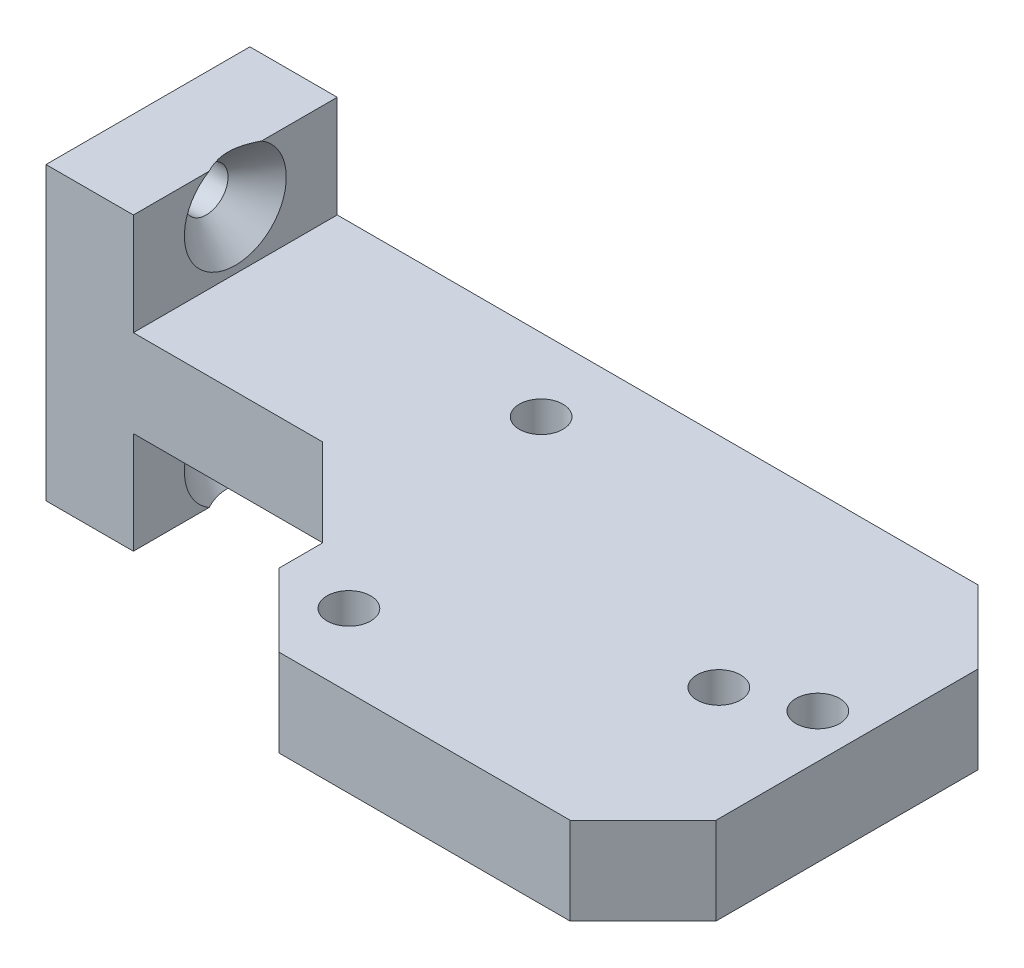
ISO-10303-21;
HEADER;
FILE_DESCRIPTION(('STEP AP214'),'2;1');
FILE_NAME('part.step','',(''),(''),'','','');
FILE_SCHEMA(('AUTOMOTIVE_DESIGN { 1 0 10303 214 1 1 1 1 }'));
ENDSEC;
DATA;
#1=APPLICATION_CONTEXT('core data for automotive mechanical design processes');
#2=APPLICATION_PROTOCOL_DEFINITION('international standard','automotive_design',2000,#1);
#3=PRODUCT_CONTEXT('',#1,'mechanical');
#4=PRODUCT('Part','Part','',(#3));
#5=PRODUCT_RELATED_PRODUCT_CATEGORY('part','',(#4));
#6=PRODUCT_DEFINITION_FORMATION('','',#4);
#7=PRODUCT_DEFINITION_CONTEXT('part definition',#1,'design');
#8=PRODUCT_DEFINITION('design','',#6,#7);
#9=PRODUCT_DEFINITION_SHAPE('','',#8);
#10=(LENGTH_UNIT() NAMED_UNIT(*) SI_UNIT(.MILLI.,.METRE.));
#11=(NAMED_UNIT(*) PLANE_ANGLE_UNIT() SI_UNIT($,.RADIAN.));
#12=(NAMED_UNIT(*) SI_UNIT($,.STERADIAN.) SOLID_ANGLE_UNIT());
#13=UNCERTAINTY_MEASURE_WITH_UNIT(LENGTH_MEASURE(1.E-05),#10,'distance_accuracy_value','');
#14=(GEOMETRIC_REPRESENTATION_CONTEXT(3) GLOBAL_UNCERTAINTY_ASSIGNED_CONTEXT((#13)) GLOBAL_UNIT_ASSIGNED_CONTEXT((#10,
#11,#12)) REPRESENTATION_CONTEXT('',''));
#15=CARTESIAN_POINT('',(0.,0.,0.));
#16=DIRECTION('',(0.,0.,1.));
#17=DIRECTION('',(1.,0.,0.));
#18=AXIS2_PLACEMENT_3D('',#15,#16,#17);
#19=CARTESIAN_POINT('',(0.,3.,0.));
#20=DIRECTION('',(0.,1.,0.));
#21=DIRECTION('',(0.,0.,1.));
#22=AXIS2_PLACEMENT_3D('',#19,#20,#21);
#23=PLANE('',#22);
#24=CARTESIAN_POINT('',(29.8,3.,8.99999999999999));
#25=DIRECTION('',(0.,1.,0.));
#26=DIRECTION('',(0.,0.,1.));
#27=AXIS2_PLACEMENT_3D('',#24,#25,#26);
#28=CIRCLE('',#27,1.5);
#29=CARTESIAN_POINT('',(29.8,3.,10.5));
#30=VERTEX_POINT('',#29);
#31=EDGE_CURVE('E199',#30,#30,#28,.T.);
#32=ORIENTED_EDGE('',*,*,#31,.F.);
#33=EDGE_LOOP('',(#32));
#34=FACE_BOUND('',#33,.T.);
#35=CARTESIAN_POINT('',(25.,3.,-9.00000000000001));
#36=DIRECTION('',(0.,1.,0.));
#37=DIRECTION('',(0.,0.,1.));
#38=AXIS2_PLACEMENT_3D('',#35,#36,#37);
#39=CIRCLE('',#38,1.5);
#40=CARTESIAN_POINT('',(25.,3.,-7.50000000000001));
#41=VERTEX_POINT('',#40);
#42=EDGE_CURVE('E211',#41,#41,#39,.T.);
#43=ORIENTED_EDGE('',*,*,#42,.F.);
#44=EDGE_LOOP('',(#43));
#45=FACE_BOUND('',#44,.T.);
#46=CARTESIAN_POINT('',(52.,3.,-1.00000000000001));
#47=DIRECTION('',(0.,1.,0.));
#48=DIRECTION('',(0.,0.,1.));
#49=AXIS2_PLACEMENT_3D('',#46,#47,#48);
#50=CIRCLE('',#49,1.5);
#51=CARTESIAN_POINT('',(52.,3.,0.499999999999996));
#52=VERTEX_POINT('',#51);
#53=EDGE_CURVE('E205',#52,#52,#50,.T.);
#54=ORIENTED_EDGE('',*,*,#53,.F.);
#55=EDGE_LOOP('',(#54));
#56=FACE_BOUND('',#55,.T.);
#57=CARTESIAN_POINT('',(47.2,3.,0.999999999999996));
#58=DIRECTION('',(0.,1.,0.));
#59=DIRECTION('',(0.,0.,1.));
#60=AXIS2_PLACEMENT_3D('',#57,#58,#59);
#61=CIRCLE('',#60,1.5);
#62=CARTESIAN_POINT('',(47.2,3.,2.5));
#63=VERTEX_POINT('',#62);
#64=EDGE_CURVE('E193',#63,#63,#61,.T.);
#65=ORIENTED_EDGE('',*,*,#64,.F.);
#66=EDGE_LOOP('',(#65));
#67=FACE_BOUND('',#66,.T.);
#68=DIRECTION('',(0.,0.,-1.));
#69=VECTOR('',#68,1.);
#70=CARTESIAN_POINT('',(55.,3.,14.));
#71=LINE('',#70,#69);
#72=CARTESIAN_POINT('',(55.,3.,9.00000000000001));
#73=VERTEX_POINT('',#72);
#74=CARTESIAN_POINT('',(55.,3.,-9.));
#75=VERTEX_POINT('',#74);
#76=EDGE_CURVE('E227',#73,#75,#71,.T.);
#77=ORIENTED_EDGE('',*,*,#76,.T.);
#78=DIRECTION('',(0.707106781186546,0.,0.707106781186549));
#79=VECTOR('',#78,1.);
#80=CARTESIAN_POINT('',(32.0000000000001,3.,-32.));
#81=LINE('',#80,#79);
#82=CARTESIAN_POINT('',(50.,3.,-14.));
#83=VERTEX_POINT('',#82);
#84=EDGE_CURVE('E567',#75,#83,#81,.F.);
#85=ORIENTED_EDGE('',*,*,#84,.T.);
#86=DIRECTION('',(-1.,0.,0.));
#87=VECTOR('',#86,1.);
#88=CARTESIAN_POINT('',(55.,3.,-14.));
#89=LINE('',#88,#87);
#90=CARTESIAN_POINT('',(6.,3.,-14.));
#91=VERTEX_POINT('',#90);
#92=EDGE_CURVE('E217',#83,#91,#89,.T.);
#93=ORIENTED_EDGE('',*,*,#92,.T.);
#94=DIRECTION('',(0.,0.,1.));
#95=VECTOR('',#94,1.);
#96=CARTESIAN_POINT('',(6.,3.,0.));
#97=LINE('',#96,#95);
#98=CARTESIAN_POINT('',(6.,3.,0.));
#99=VERTEX_POINT('',#98);
#100=EDGE_CURVE('E160',#91,#99,#97,.T.);
#101=ORIENTED_EDGE('',*,*,#100,.T.);
#102=DIRECTION('',(1.,0.,0.));
#103=VECTOR('',#102,1.);
#104=CARTESIAN_POINT('',(0.,3.,0.));
#105=LINE('',#104,#103);
#106=CARTESIAN_POINT('',(19.,3.,0.));
#107=VERTEX_POINT('',#106);
#108=EDGE_CURVE('E219',#99,#107,#105,.T.);
#109=ORIENTED_EDGE('',*,*,#108,.T.);
#110=DIRECTION('',(-0.707106781186544,0.,-0.707106781186551));
#111=VECTOR('',#110,1.);
#112=CARTESIAN_POINT('',(25.,3.,6.00000000000004));
#113=LINE('',#112,#111);
#114=CARTESIAN_POINT('',(25.,3.,6.00000000000004));
#115=VERTEX_POINT('',#114);
#116=EDGE_CURVE('E575',#107,#115,#113,.F.);
#117=ORIENTED_EDGE('',*,*,#116,.T.);
#118=DIRECTION('',(0.,0.,1.));
#119=VECTOR('',#118,1.);
#120=CARTESIAN_POINT('',(25.,3.,0.));
#121=LINE('',#120,#119);
#122=CARTESIAN_POINT('',(25.,3.,8.99999999999999));
#123=VERTEX_POINT('',#122);
#124=EDGE_CURVE('E223',#115,#123,#121,.T.);
#125=ORIENTED_EDGE('',*,*,#124,.T.);
#126=DIRECTION('',(-0.707106781186546,0.,-0.707106781186549));
#127=VECTOR('',#126,1.);
#128=CARTESIAN_POINT('',(8.00000000000006,3.,-8.00000000000003));
#129=LINE('',#128,#127);
#130=CARTESIAN_POINT('',(30.,3.,14.));
#131=VERTEX_POINT('',#130);
#132=EDGE_CURVE('E59',#123,#131,#129,.F.);
#133=ORIENTED_EDGE('',*,*,#132,.T.);
#134=DIRECTION('',(1.,0.,0.));
#135=VECTOR('',#134,1.);
#136=CARTESIAN_POINT('',(25.,3.,14.));
#137=LINE('',#136,#135);
#138=CARTESIAN_POINT('',(50.,3.,14.));
#139=VERTEX_POINT('',#138);
#140=EDGE_CURVE('E225',#131,#139,#137,.T.);
#141=ORIENTED_EDGE('',*,*,#140,.T.);
#142=DIRECTION('',(-0.707106781186549,0.,0.707106781186546));
#143=VECTOR('',#142,1.);
#144=CARTESIAN_POINT('',(31.9999999999999,3.,32.));
#145=LINE('',#144,#143);
#146=EDGE_CURVE('E591',#139,#73,#145,.F.);
#147=ORIENTED_EDGE('',*,*,#146,.T.);
#148=EDGE_LOOP('',(#77,#85,#93,#101,#109,#117,#125,#133,#141,#147));
#149=FACE_BOUND('',#148,.T.);
#150=ADVANCED_FACE('F37',(#34,#45,#56,#67,#149),#23,.T.);
#151=CARTESIAN_POINT('',(0.,-3.,0.));
#152=DIRECTION('',(0.,1.,0.));
#153=DIRECTION('',(0.,0.,1.));
#154=AXIS2_PLACEMENT_3D('',#151,#152,#153);
#155=PLANE('',#154);
#156=CARTESIAN_POINT('',(47.2,-3.,0.999999999999996));
#157=DIRECTION('',(0.,1.,0.));
#158=DIRECTION('',(0.,0.,1.));
#159=AXIS2_PLACEMENT_3D('',#156,#157,#158);
#160=CIRCLE('',#159,1.5);
#161=CARTESIAN_POINT('',(47.2,-3.,2.5));
#162=VERTEX_POINT('',#161);
#163=EDGE_CURVE('E192',#162,#162,#160,.T.);
#164=ORIENTED_EDGE('',*,*,#163,.T.);
#165=EDGE_LOOP('',(#164));
#166=FACE_BOUND('',#165,.T.);
#167=CARTESIAN_POINT('',(29.8,-3.,8.99999999999999));
#168=DIRECTION('',(0.,1.,0.));
#169=DIRECTION('',(0.,0.,1.));
#170=AXIS2_PLACEMENT_3D('',#167,#168,#169);
#171=CIRCLE('',#170,1.5);
#172=CARTESIAN_POINT('',(29.8,-3.,10.5));
#173=VERTEX_POINT('',#172);
#174=EDGE_CURVE('E196',#173,#173,#171,.T.);
#175=ORIENTED_EDGE('',*,*,#174,.T.);
#176=EDGE_LOOP('',(#175));
#177=FACE_BOUND('',#176,.T.);
#178=CARTESIAN_POINT('',(52.,-3.,-1.00000000000001));
#179=DIRECTION('',(0.,1.,0.));
#180=DIRECTION('',(0.,0.,1.));
#181=AXIS2_PLACEMENT_3D('',#178,#179,#180);
#182=CIRCLE('',#181,1.5);
#183=CARTESIAN_POINT('',(52.,-3.,0.499999999999996));
#184=VERTEX_POINT('',#183);
#185=EDGE_CURVE('E202',#184,#184,#182,.T.);
#186=ORIENTED_EDGE('',*,*,#185,.T.);
#187=EDGE_LOOP('',(#186));
#188=FACE_BOUND('',#187,.T.);
#189=CARTESIAN_POINT('',(25.,-3.,-9.00000000000001));
#190=DIRECTION('',(0.,1.,0.));
#191=DIRECTION('',(0.,0.,1.));
#192=AXIS2_PLACEMENT_3D('',#189,#190,#191);
#193=CIRCLE('',#192,1.5);
#194=CARTESIAN_POINT('',(25.,-3.,-7.50000000000001));
#195=VERTEX_POINT('',#194);
#196=EDGE_CURVE('E208',#195,#195,#193,.T.);
#197=ORIENTED_EDGE('',*,*,#196,.T.);
#198=EDGE_LOOP('',(#197));
#199=FACE_BOUND('',#198,.T.);
#200=DIRECTION('',(-1.,0.,0.));
#201=VECTOR('',#200,1.);
#202=CARTESIAN_POINT('',(55.,-3.,-14.));
#203=LINE('',#202,#201);
#204=CARTESIAN_POINT('',(50.,-3.,-14.));
#205=VERTEX_POINT('',#204);
#206=CARTESIAN_POINT('',(6.,-3.,-14.));
#207=VERTEX_POINT('',#206);
#208=EDGE_CURVE('E214',#205,#207,#203,.T.);
#209=ORIENTED_EDGE('',*,*,#208,.F.);
#210=DIRECTION('',(-0.707106781186546,0.,-0.707106781186549));
#211=VECTOR('',#210,1.);
#212=CARTESIAN_POINT('',(50.,-3.,-14.));
#213=LINE('',#212,#211);
#214=CARTESIAN_POINT('',(55.,-3.,-9.));
#215=VERTEX_POINT('',#214);
#216=EDGE_CURVE('E573',#205,#215,#213,.F.);
#217=ORIENTED_EDGE('',*,*,#216,.T.);
#218=DIRECTION('',(0.,0.,-1.));
#219=VECTOR('',#218,1.);
#220=CARTESIAN_POINT('',(55.,-3.,14.));
#221=LINE('',#220,#219);
#222=CARTESIAN_POINT('',(55.,-3.,9.00000000000001));
#223=VERTEX_POINT('',#222);
#224=EDGE_CURVE('E220',#223,#215,#221,.T.);
#225=ORIENTED_EDGE('',*,*,#224,.F.);
#226=DIRECTION('',(0.707106781186549,0.,-0.707106781186546));
#227=VECTOR('',#226,1.);
#228=CARTESIAN_POINT('',(55.,-3.,9.00000000000001));
#229=LINE('',#228,#227);
#230=CARTESIAN_POINT('',(50.,-3.,14.));
#231=VERTEX_POINT('',#230);
#232=EDGE_CURVE('E577',#223,#231,#229,.F.);
#233=ORIENTED_EDGE('',*,*,#232,.T.);
#234=DIRECTION('',(1.,0.,0.));
#235=VECTOR('',#234,1.);
#236=CARTESIAN_POINT('',(25.,-3.,14.));
#237=LINE('',#236,#235);
#238=CARTESIAN_POINT('',(30.,-3.,14.));
#239=VERTEX_POINT('',#238);
#240=EDGE_CURVE('E238',#239,#231,#237,.T.);
#241=ORIENTED_EDGE('',*,*,#240,.F.);
#242=DIRECTION('',(0.707106781186546,0.,0.707106781186549));
#243=VECTOR('',#242,1.);
#244=CARTESIAN_POINT('',(30.,-3.,14.));
#245=LINE('',#244,#243);
#246=CARTESIAN_POINT('',(25.,-3.,8.99999999999999));
#247=VERTEX_POINT('',#246);
#248=EDGE_CURVE('E574',#239,#247,#245,.F.);
#249=ORIENTED_EDGE('',*,*,#248,.T.);
#250=DIRECTION('',(0.,0.,1.));
#251=VECTOR('',#250,1.);
#252=CARTESIAN_POINT('',(25.,-3.,0.));
#253=LINE('',#252,#251);
#254=CARTESIAN_POINT('',(25.,-3.,6.00000000000004));
#255=VERTEX_POINT('',#254);
#256=EDGE_CURVE('E235',#255,#247,#253,.T.);
#257=ORIENTED_EDGE('',*,*,#256,.F.);
#258=DIRECTION('',(0.707106781186544,0.,0.707106781186551));
#259=VECTOR('',#258,1.);
#260=CARTESIAN_POINT('',(9.50000000000011,-3.,-9.50000000000001));
#261=LINE('',#260,#259);
#262=CARTESIAN_POINT('',(19.,-3.,0.));
#263=VERTEX_POINT('',#262);
#264=EDGE_CURVE('E579',#255,#263,#261,.F.);
#265=ORIENTED_EDGE('',*,*,#264,.T.);
#266=DIRECTION('',(1.,0.,0.));
#267=VECTOR('',#266,1.);
#268=CARTESIAN_POINT('',(0.,-3.,0.));
#269=LINE('',#268,#267);
#270=CARTESIAN_POINT('',(6.,-3.,0.));
#271=VERTEX_POINT('',#270);
#272=EDGE_CURVE('E232',#271,#263,#269,.T.);
#273=ORIENTED_EDGE('',*,*,#272,.F.);
#274=DIRECTION('',(0.,0.,1.));
#275=VECTOR('',#274,1.);
#276=CARTESIAN_POINT('',(6.,-3.,0.));
#277=LINE('',#276,#275);
#278=EDGE_CURVE('E181',#207,#271,#277,.T.);
#279=ORIENTED_EDGE('',*,*,#278,.F.);
#280=EDGE_LOOP('',(#209,#217,#225,#233,#241,#249,#257,#265,#273,#279));
#281=FACE_BOUND('',#280,.T.);
#282=ADVANCED_FACE('F322',(#166,#177,#188,#199,#281),#155,.F.);
#283=CARTESIAN_POINT('',(55.,3.,-14.));
#284=DIRECTION('',(0.,0.,1.));
#285=DIRECTION('',(1.,0.,0.));
#286=AXIS2_PLACEMENT_3D('',#283,#284,#285);
#287=PLANE('',#286);
#288=ORIENTED_EDGE('',*,*,#92,.F.);
#289=DIRECTION('',(0.,-1.,0.));
#290=VECTOR('',#289,1.);
#291=CARTESIAN_POINT('',(50.,3.,-14.));
#292=LINE('',#291,#290);
#293=EDGE_CURVE('E570',#83,#205,#292,.T.);
#294=ORIENTED_EDGE('',*,*,#293,.T.);
#295=ORIENTED_EDGE('',*,*,#208,.T.);
#296=DIRECTION('',(0.,1.,0.));
#297=VECTOR('',#296,1.);
#298=CARTESIAN_POINT('',(6.,10.,-14.));
#299=LINE('',#298,#297);
#300=CARTESIAN_POINT('',(6.,-9.99999999999999,-14.));
#301=VERTEX_POINT('',#300);
#302=EDGE_CURVE('E164',#301,#207,#299,.T.);
#303=ORIENTED_EDGE('',*,*,#302,.F.);
#304=DIRECTION('',(-1.,0.,0.));
#305=VECTOR('',#304,1.);
#306=CARTESIAN_POINT('',(6.,-9.99999999999999,-14.));
#307=LINE('',#306,#305);
#308=CARTESIAN_POINT('',(0.,-9.99999999999999,-14.));
#309=VERTEX_POINT('',#308);
#310=EDGE_CURVE('E545',#301,#309,#307,.T.);
#311=ORIENTED_EDGE('',*,*,#310,.T.);
#312=DIRECTION('',(0.,-1.,0.));
#313=VECTOR('',#312,1.);
#314=CARTESIAN_POINT('',(0.,3.,-14.));
#315=LINE('',#314,#313);
#316=CARTESIAN_POINT('',(0.,10.,-14.));
#317=VERTEX_POINT('',#316);
#318=EDGE_CURVE('E179',#317,#309,#315,.T.);
#319=ORIENTED_EDGE('',*,*,#318,.F.);
#320=DIRECTION('',(-1.,0.,0.));
#321=VECTOR('',#320,1.);
#322=CARTESIAN_POINT('',(6.,10.,-14.));
#323=LINE('',#322,#321);
#324=CARTESIAN_POINT('',(6.,10.,-14.));
#325=VERTEX_POINT('',#324);
#326=EDGE_CURVE('E172',#325,#317,#323,.T.);
#327=ORIENTED_EDGE('',*,*,#326,.F.);
#328=EDGE_CURVE('E152',#91,#325,#299,.T.);
#329=ORIENTED_EDGE('',*,*,#328,.F.);
#330=EDGE_LOOP('',(#288,#294,#295,#303,#311,#319,#327,#329));
#331=FACE_BOUND('',#330,.T.);
#332=ADVANCED_FACE('F177',(#331),#287,.F.);
#333=CARTESIAN_POINT('',(0.,3.,-14.));
#334=DIRECTION('',(1.,0.,0.));
#335=DIRECTION('',(0.,0.,-1.));
#336=AXIS2_PLACEMENT_3D('',#333,#334,#335);
#337=PLANE('',#336);
#338=ORIENTED_EDGE('',*,*,#318,.T.);
#339=DIRECTION('',(0.,0.,-1.));
#340=VECTOR('',#339,1.);
#341=CARTESIAN_POINT('',(0.,-9.99999999999999,-14.));
#342=LINE('',#341,#340);
#343=CARTESIAN_POINT('',(0.,-10.,0.));
#344=VERTEX_POINT('',#343);
#345=EDGE_CURVE('E165',#344,#309,#342,.T.);
#346=ORIENTED_EDGE('',*,*,#345,.F.);
#347=DIRECTION('',(0.,-1.,0.));
#348=VECTOR('',#347,1.);
#349=CARTESIAN_POINT('',(0.,3.,0.));
#350=LINE('',#349,#348);
#351=CARTESIAN_POINT('',(0.,10.,0.));
#352=VERTEX_POINT('',#351);
#353=EDGE_CURVE('E230',#352,#344,#350,.T.);
#354=ORIENTED_EDGE('',*,*,#353,.F.);
#355=DIRECTION('',(0.,0.,1.));
#356=VECTOR('',#355,1.);
#357=CARTESIAN_POINT('',(0.,10.,-14.));
#358=LINE('',#357,#356);
#359=EDGE_CURVE('E535',#317,#352,#358,.T.);
#360=ORIENTED_EDGE('',*,*,#359,.F.);
#361=EDGE_LOOP('',(#338,#346,#354,#360));
#362=FACE_BOUND('',#361,.T.);
#363=CARTESIAN_POINT('',(0.,-7.,-7.));
#364=DIRECTION('',(1.,0.,0.));
#365=DIRECTION('',(0.,0.,-1.));
#366=AXIS2_PLACEMENT_3D('',#363,#364,#365);
#367=CIRCLE('',#366,1.5);
#368=CARTESIAN_POINT('',(0.,-7.,-8.50000000000001));
#369=VERTEX_POINT('',#368);
#370=EDGE_CURVE('E530',#369,#369,#367,.T.);
#371=ORIENTED_EDGE('',*,*,#370,.T.);
#372=EDGE_LOOP('',(#371));
#373=FACE_BOUND('',#372,.T.);
#374=CARTESIAN_POINT('',(0.,7.,-7.));
#375=DIRECTION('',(1.,0.,0.));
#376=DIRECTION('',(0.,0.,-1.));
#377=AXIS2_PLACEMENT_3D('',#374,#375,#376);
#378=CIRCLE('',#377,1.5);
#379=CARTESIAN_POINT('',(0.,7.,-8.50000000000001));
#380=VERTEX_POINT('',#379);
#381=EDGE_CURVE('E532',#380,#380,#378,.T.);
#382=ORIENTED_EDGE('',*,*,#381,.T.);
#383=EDGE_LOOP('',(#382));
#384=FACE_BOUND('',#383,.T.);
#385=ADVANCED_FACE('F350',(#362,#373,#384),#337,.F.);
#386=CARTESIAN_POINT('',(0.,3.,0.));
#387=DIRECTION('',(0.,0.,-1.));
#388=DIRECTION('',(-1.,0.,0.));
#389=AXIS2_PLACEMENT_3D('',#386,#387,#388);
#390=PLANE('',#389);
#391=ORIENTED_EDGE('',*,*,#272,.T.);
#392=DIRECTION('',(0.,1.,0.));
#393=VECTOR('',#392,1.);
#394=CARTESIAN_POINT('',(19.,3.,0.));
#395=LINE('',#394,#393);
#396=EDGE_CURVE('E564',#263,#107,#395,.T.);
#397=ORIENTED_EDGE('',*,*,#396,.T.);
#398=ORIENTED_EDGE('',*,*,#108,.F.);
#399=DIRECTION('',(0.,-1.,0.));
#400=VECTOR('',#399,1.);
#401=CARTESIAN_POINT('',(6.,10.,0.));
#402=LINE('',#401,#400);
#403=CARTESIAN_POINT('',(6.,10.,0.));
#404=VERTEX_POINT('',#403);
#405=EDGE_CURVE('E539',#404,#99,#402,.T.);
#406=ORIENTED_EDGE('',*,*,#405,.F.);
#407=DIRECTION('',(-1.,0.,0.));
#408=VECTOR('',#407,1.);
#409=CARTESIAN_POINT('',(6.,10.,0.));
#410=LINE('',#409,#408);
#411=EDGE_CURVE('E182',#404,#352,#410,.T.);
#412=ORIENTED_EDGE('',*,*,#411,.T.);
#413=ORIENTED_EDGE('',*,*,#353,.T.);
#414=DIRECTION('',(-1.,0.,0.));
#415=VECTOR('',#414,1.);
#416=CARTESIAN_POINT('',(6.,-10.,0.));
#417=LINE('',#416,#415);
#418=CARTESIAN_POINT('',(6.,-10.,0.));
#419=VERTEX_POINT('',#418);
#420=EDGE_CURVE('E187',#419,#344,#417,.T.);
#421=ORIENTED_EDGE('',*,*,#420,.F.);
#422=EDGE_CURVE('E174',#271,#419,#402,.T.);
#423=ORIENTED_EDGE('',*,*,#422,.F.);
#424=EDGE_LOOP('',(#391,#397,#398,#406,#412,#413,#421,#423));
#425=FACE_BOUND('',#424,.T.);
#426=ADVANCED_FACE('F346',(#425),#390,.F.);
#427=CARTESIAN_POINT('',(25.,3.,0.));
#428=DIRECTION('',(1.,0.,0.));
#429=DIRECTION('',(0.,0.,-1.));
#430=AXIS2_PLACEMENT_3D('',#427,#428,#429);
#431=PLANE('',#430);
#432=ORIENTED_EDGE('',*,*,#256,.T.);
#433=DIRECTION('',(0.,1.,0.));
#434=VECTOR('',#433,1.);
#435=CARTESIAN_POINT('',(25.,3.,8.99999999999999));
#436=LINE('',#435,#434);
#437=EDGE_CURVE('E11',#247,#123,#436,.T.);
#438=ORIENTED_EDGE('',*,*,#437,.T.);
#439=ORIENTED_EDGE('',*,*,#124,.F.);
#440=DIRECTION('',(0.,-1.,0.));
#441=VECTOR('',#440,1.);
#442=CARTESIAN_POINT('',(25.,-3.,6.00000000000004));
#443=LINE('',#442,#441);
#444=EDGE_CURVE('E286',#115,#255,#443,.T.);
#445=ORIENTED_EDGE('',*,*,#444,.T.);
#446=EDGE_LOOP('',(#432,#438,#439,#445));
#447=FACE_BOUND('',#446,.T.);
#448=ADVANCED_FACE('F343',(#447),#431,.F.);
#449=CARTESIAN_POINT('',(25.,3.,14.));
#450=DIRECTION('',(0.,0.,-1.));
#451=DIRECTION('',(-1.,0.,0.));
#452=AXIS2_PLACEMENT_3D('',#449,#450,#451);
#453=PLANE('',#452);
#454=ORIENTED_EDGE('',*,*,#240,.T.);
#455=DIRECTION('',(0.,1.,0.));
#456=VECTOR('',#455,1.);
#457=CARTESIAN_POINT('',(50.,3.,14.));
#458=LINE('',#457,#456);
#459=EDGE_CURVE('E46',#231,#139,#458,.T.);
#460=ORIENTED_EDGE('',*,*,#459,.T.);
#461=ORIENTED_EDGE('',*,*,#140,.F.);
#462=DIRECTION('',(0.,-1.,0.));
#463=VECTOR('',#462,1.);
#464=CARTESIAN_POINT('',(30.,3.,14.));
#465=LINE('',#464,#463);
#466=EDGE_CURVE('E594',#131,#239,#465,.T.);
#467=ORIENTED_EDGE('',*,*,#466,.T.);
#468=EDGE_LOOP('',(#454,#460,#461,#467));
#469=FACE_BOUND('',#468,.T.);
#470=ADVANCED_FACE('F339',(#469),#453,.F.);
#471=CARTESIAN_POINT('',(55.,3.,14.));
#472=DIRECTION('',(-1.,0.,0.));
#473=DIRECTION('',(0.,0.,1.));
#474=AXIS2_PLACEMENT_3D('',#471,#472,#473);
#475=PLANE('',#474);
#476=ORIENTED_EDGE('',*,*,#224,.T.);
#477=DIRECTION('',(0.,1.,0.));
#478=VECTOR('',#477,1.);
#479=CARTESIAN_POINT('',(55.,3.,-9.));
#480=LINE('',#479,#478);
#481=EDGE_CURVE('E588',#215,#75,#480,.T.);
#482=ORIENTED_EDGE('',*,*,#481,.T.);
#483=ORIENTED_EDGE('',*,*,#76,.F.);
#484=DIRECTION('',(0.,-1.,0.));
#485=VECTOR('',#484,1.);
#486=CARTESIAN_POINT('',(55.,3.,9.00000000000001));
#487=LINE('',#486,#485);
#488=EDGE_CURVE('E585',#73,#223,#487,.T.);
#489=ORIENTED_EDGE('',*,*,#488,.T.);
#490=EDGE_LOOP('',(#476,#482,#483,#489));
#491=FACE_BOUND('',#490,.T.);
#492=ADVANCED_FACE('F336',(#491),#475,.F.);
#493=CARTESIAN_POINT('',(25.,3.,-9.00000000000001));
#494=DIRECTION('',(0.,-1.,0.));
#495=DIRECTION('',(0.,0.,-1.));
#496=AXIS2_PLACEMENT_3D('',#493,#494,#495);
#497=CYLINDRICAL_SURFACE('',#496,1.5);
#498=ORIENTED_EDGE('',*,*,#42,.T.);
#499=EDGE_LOOP('',(#498));
#500=FACE_BOUND('',#499,.T.);
#501=ORIENTED_EDGE('',*,*,#196,.F.);
#502=EDGE_LOOP('',(#501));
#503=FACE_BOUND('',#502,.T.);
#504=ADVANCED_FACE('F333',(#500,#503),#497,.F.);
#505=CARTESIAN_POINT('',(52.,3.,-1.00000000000001));
#506=DIRECTION('',(0.,-1.,0.));
#507=DIRECTION('',(0.,0.,-1.));
#508=AXIS2_PLACEMENT_3D('',#505,#506,#507);
#509=CYLINDRICAL_SURFACE('',#508,1.5);
#510=ORIENTED_EDGE('',*,*,#53,.T.);
#511=EDGE_LOOP('',(#510));
#512=FACE_BOUND('',#511,.T.);
#513=ORIENTED_EDGE('',*,*,#185,.F.);
#514=EDGE_LOOP('',(#513));
#515=FACE_BOUND('',#514,.T.);
#516=ADVANCED_FACE('F390',(#512,#515),#509,.F.);
#517=CARTESIAN_POINT('',(29.8,3.,8.99999999999999));
#518=DIRECTION('',(0.,-1.,0.));
#519=DIRECTION('',(0.,0.,-1.));
#520=AXIS2_PLACEMENT_3D('',#517,#518,#519);
#521=CYLINDRICAL_SURFACE('',#520,1.5);
#522=ORIENTED_EDGE('',*,*,#31,.T.);
#523=EDGE_LOOP('',(#522));
#524=FACE_BOUND('',#523,.T.);
#525=ORIENTED_EDGE('',*,*,#174,.F.);
#526=EDGE_LOOP('',(#525));
#527=FACE_BOUND('',#526,.T.);
#528=ADVANCED_FACE('F397',(#524,#527),#521,.F.);
#529=CARTESIAN_POINT('',(47.2,3.,0.999999999999996));
#530=DIRECTION('',(0.,-1.,0.));
#531=DIRECTION('',(0.,0.,-1.));
#532=AXIS2_PLACEMENT_3D('',#529,#530,#531);
#533=CYLINDRICAL_SURFACE('',#532,1.5);
#534=ORIENTED_EDGE('',*,*,#64,.T.);
#535=EDGE_LOOP('',(#534));
#536=FACE_BOUND('',#535,.T.);
#537=ORIENTED_EDGE('',*,*,#163,.F.);
#538=EDGE_LOOP('',(#537));
#539=FACE_BOUND('',#538,.T.);
#540=ADVANCED_FACE('F278',(#536,#539),#533,.F.);
#541=CARTESIAN_POINT('',(6.,-7.,-7.));
#542=DIRECTION('',(-1.,0.,0.));
#543=DIRECTION('',(0.,0.,1.));
#544=AXIS2_PLACEMENT_3D('',#541,#542,#543);
#545=CYLINDRICAL_SURFACE('',#544,1.5);
#546=CARTESIAN_POINT('',(3.99999999999999,-7.,-7.));
#547=DIRECTION('',(-1.,0.,0.));
#548=DIRECTION('',(0.,0.,1.));
#549=AXIS2_PLACEMENT_3D('',#546,#547,#548);
#550=CIRCLE('',#549,1.5);
#551=CARTESIAN_POINT('',(3.99999999999999,-7.,-5.5));
#552=VERTEX_POINT('',#551);
#553=EDGE_CURVE('E244',#552,#552,#550,.F.);
#554=ORIENTED_EDGE('',*,*,#553,.T.);
#555=EDGE_LOOP('',(#554));
#556=FACE_BOUND('',#555,.T.);
#557=ORIENTED_EDGE('',*,*,#370,.F.);
#558=EDGE_LOOP('',(#557));
#559=FACE_BOUND('',#558,.T.);
#560=ADVANCED_FACE('F271',(#556,#559),#545,.F.);
#561=CARTESIAN_POINT('',(6.,-9.99999999999999,-14.));
#562=DIRECTION('',(0.,1.,0.));
#563=DIRECTION('',(0.,0.,1.));
#564=AXIS2_PLACEMENT_3D('',#561,#562,#563);
#565=PLANE('',#564);
#566=DIRECTION('',(0.,0.,-1.));
#567=VECTOR('',#566,1.);
#568=CARTESIAN_POINT('',(6.,-9.99999999999999,-14.));
#569=LINE('',#568,#567);
#570=CARTESIAN_POINT('',(6.,-9.99999999999999,-8.80277563773205));
#571=VERTEX_POINT('',#570);
#572=EDGE_CURVE('E541',#571,#301,#569,.T.);
#573=ORIENTED_EDGE('',*,*,#572,.F.);
#574=CARTESIAN_POINT('',(6.,-9.99999999999999,-8.80277563773205));
#575=CARTESIAN_POINT('',(5.96818899112635,-10.,-8.74100396623282));
#576=CARTESIAN_POINT('',(5.93731795904625,-10.,-8.6787491902859));
#577=CARTESIAN_POINT('',(5.87775738071083,-10.,-8.55316230294703));
#578=CARTESIAN_POINT('',(5.84906911636809,-10.,-8.4898295848033));
#579=CARTESIAN_POINT('',(5.76645014604669,-10.,-8.29737509642786));
#580=CARTESIAN_POINT('',(5.71636255295913,-10.,-8.16655098198249));
#581=CARTESIAN_POINT('',(5.63044710724887,-10.,-7.90274807221306));
#582=CARTESIAN_POINT('',(5.594384917051,-10.,-7.76984711947473));
#583=CARTESIAN_POINT('',(5.53870442336001,-10.,-7.50089499507222));
#584=CARTESIAN_POINT('',(5.51903964375667,-10.,-7.36485385791006));
#585=CARTESIAN_POINT('',(5.50151511055322,-10.,-7.13398465123141));
#586=CARTESIAN_POINT('',(5.49877303572149,-10.,-7.03951077270798));
#587=CARTESIAN_POINT('',(5.50223164539297,-10.,-6.85068406489911));
#588=CARTESIAN_POINT('',(5.50843566873586,-10.,-6.75633129396924));
#589=CARTESIAN_POINT('',(5.52943429404291,-10.,-6.56848448697398));
#590=CARTESIAN_POINT('',(5.54423984742198,-10.,-6.47499170026922));
#591=CARTESIAN_POINT('',(5.58162556560793,-10.,-6.28960267481445));
#592=CARTESIAN_POINT('',(5.60420517040024,-10.,-6.19770632156391));
#593=CARTESIAN_POINT('',(5.65267392192157,-10.,-6.0278456811356));
#594=CARTESIAN_POINT('',(5.67773503261898,-10.,-5.94964105984981));
#595=CARTESIAN_POINT('',(5.73223307623988,-10.,-5.79476785200021));
#596=CARTESIAN_POINT('',(5.76167065542952,-10.,-5.71809949419463));
#597=CARTESIAN_POINT('',(5.82416781544575,-10.,-5.56652422237304));
#598=CARTESIAN_POINT('',(5.85721680559945,-10.,-5.49161290089966));
#599=CARTESIAN_POINT('',(5.92641710117391,-10.,-5.3433137941181));
#600=CARTESIAN_POINT('',(5.96256563084473,-10.,-5.26992471725364));
#601=CARTESIAN_POINT('',(6.,-10.,-5.19722436226796));
#602=B_SPLINE_CURVE_WITH_KNOTS('',3,(#574,#575,#576,#577,#578,#579,#580,#581,#582,#583,#584,
#585,#586,#587,#588,#589,#590,#591,#592,#593,#594,#595,#596,#597,#598,#599,#600,#601),
.UNSPECIFIED.,.F.,.F.,(4,2,2,2,2,2,2,2,2,2,2,2,2,4),(0.,0.208428681011182,0.416978839626322,
0.83662972093161,1.24893230118915,1.66006225788181,1.94320380409917,2.22645105102828,
2.51005971939035,2.79364796188199,3.0398714415324,3.28613131679366,3.53168747610903,
3.77702598291769),.UNSPECIFIED.);
#603=CARTESIAN_POINT('',(6.,-10.,-5.19722436226796));
#604=VERTEX_POINT('',#603);
#605=EDGE_CURVE('E250',#571,#604,#602,.T.);
#606=ORIENTED_EDGE('',*,*,#605,.T.);
#607=EDGE_CURVE('E542',#419,#604,#569,.T.);
#608=ORIENTED_EDGE('',*,*,#607,.F.);
#609=ORIENTED_EDGE('',*,*,#420,.T.);
#610=ORIENTED_EDGE('',*,*,#345,.T.);
#611=ORIENTED_EDGE('',*,*,#310,.F.);
#612=EDGE_LOOP('',(#573,#606,#608,#609,#610,#611));
#613=FACE_BOUND('',#612,.T.);
#614=ADVANCED_FACE('F265',(#613),#565,.F.);
#615=CARTESIAN_POINT('',(6.,0.,0.));
#616=DIRECTION('',(-1.,0.,0.));
#617=DIRECTION('',(0.,0.,1.));
#618=AXIS2_PLACEMENT_3D('',#615,#616,#617);
#619=PLANE('',#618);
#620=ORIENTED_EDGE('',*,*,#607,.T.);
#621=CARTESIAN_POINT('',(6.,-7.,-7.));
#622=DIRECTION('',(-1.,0.,0.));
#623=DIRECTION('',(0.,0.,1.));
#624=AXIS2_PLACEMENT_3D('',#621,#622,#623);
#625=CIRCLE('',#624,3.50000000000002);
#626=EDGE_CURVE('E247',#604,#571,#625,.T.);
#627=ORIENTED_EDGE('',*,*,#626,.T.);
#628=ORIENTED_EDGE('',*,*,#572,.T.);
#629=ORIENTED_EDGE('',*,*,#302,.T.);
#630=ORIENTED_EDGE('',*,*,#278,.T.);
#631=ORIENTED_EDGE('',*,*,#422,.T.);
#632=EDGE_LOOP('',(#620,#627,#628,#629,#630,#631));
#633=FACE_BOUND('',#632,.T.);
#634=ADVANCED_FACE('F270',(#633),#619,.F.);
#635=DIRECTION('',(0.,0.,1.));
#636=VECTOR('',#635,1.);
#637=CARTESIAN_POINT('',(6.,10.,-14.));
#638=LINE('',#637,#636);
#639=CARTESIAN_POINT('',(6.,10.,-8.80277563773205));
#640=VERTEX_POINT('',#639);
#641=EDGE_CURVE('E156',#325,#640,#638,.T.);
#642=ORIENTED_EDGE('',*,*,#641,.T.);
#643=CARTESIAN_POINT('',(6.,7.,-7.));
#644=DIRECTION('',(-1.,0.,0.));
#645=DIRECTION('',(0.,0.,1.));
#646=AXIS2_PLACEMENT_3D('',#643,#644,#645);
#647=CIRCLE('',#646,3.50000000000002);
#648=CARTESIAN_POINT('',(6.,10.,-5.19722436226797));
#649=VERTEX_POINT('',#648);
#650=EDGE_CURVE('E287',#640,#649,#647,.T.);
#651=ORIENTED_EDGE('',*,*,#650,.T.);
#652=EDGE_CURVE('E175',#649,#404,#638,.T.);
#653=ORIENTED_EDGE('',*,*,#652,.T.);
#654=ORIENTED_EDGE('',*,*,#405,.T.);
#655=ORIENTED_EDGE('',*,*,#100,.F.);
#656=ORIENTED_EDGE('',*,*,#328,.T.);
#657=EDGE_LOOP('',(#642,#651,#653,#654,#655,#656));
#658=FACE_BOUND('',#657,.T.);
#659=ADVANCED_FACE('F154',(#658),#619,.F.);
#660=CARTESIAN_POINT('',(6.,10.,-14.));
#661=DIRECTION('',(0.,-1.,0.));
#662=DIRECTION('',(0.,0.,-1.));
#663=AXIS2_PLACEMENT_3D('',#660,#661,#662);
#664=PLANE('',#663);
#665=ORIENTED_EDGE('',*,*,#652,.F.);
#666=CARTESIAN_POINT('',(6.,10.,-5.19722436226796));
#667=CARTESIAN_POINT('',(5.96818899112635,10.,-5.2589960337672));
#668=CARTESIAN_POINT('',(5.93731795904625,10.,-5.32125080971411));
#669=CARTESIAN_POINT('',(5.87775738071083,10.,-5.44683769705298));
#670=CARTESIAN_POINT('',(5.84906911636809,10.,-5.51017041519672));
#671=CARTESIAN_POINT('',(5.76645014604669,10.,-5.70262490357216));
#672=CARTESIAN_POINT('',(5.71636255295913,10.,-5.83344901801753));
#673=CARTESIAN_POINT('',(5.63044710724888,10.,-6.09725192778696));
#674=CARTESIAN_POINT('',(5.594384917051,10.,-6.23015288052528));
#675=CARTESIAN_POINT('',(5.53870442336001,10.,-6.49910500492779));
#676=CARTESIAN_POINT('',(5.51903964375667,10.,-6.63514614208995));
#677=CARTESIAN_POINT('',(5.50151511055322,10.,-6.8660153487686));
#678=CARTESIAN_POINT('',(5.49877303572149,10.,-6.96048922729203));
#679=CARTESIAN_POINT('',(5.50223164539297,10.,-7.14931593510091));
#680=CARTESIAN_POINT('',(5.50843566873586,10.,-7.24366870603077));
#681=CARTESIAN_POINT('',(5.52943429404292,10.,-7.43151551302604));
#682=CARTESIAN_POINT('',(5.54423984742198,10.,-7.5250082997308));
#683=CARTESIAN_POINT('',(5.58162556560793,10.,-7.71039732518557));
#684=CARTESIAN_POINT('',(5.60420517040024,10.,-7.80229367843611));
#685=CARTESIAN_POINT('',(5.65267392192157,10.,-7.97215431886442));
#686=CARTESIAN_POINT('',(5.67773503261899,10.,-8.0503589401502));
#687=CARTESIAN_POINT('',(5.73223307623989,10.,-8.2052321479998));
#688=CARTESIAN_POINT('',(5.76167065542952,10.,-8.28190050580538));
#689=CARTESIAN_POINT('',(5.82416781544575,10.,-8.43347577762697));
#690=CARTESIAN_POINT('',(5.85721680559945,10.,-8.50838709910035));
#691=CARTESIAN_POINT('',(5.92641710117391,10.,-8.65668620588191));
#692=CARTESIAN_POINT('',(5.96256563084473,10.,-8.73007528274637));
#693=CARTESIAN_POINT('',(6.,10.,-8.80277563773205));
#694=B_SPLINE_CURVE_WITH_KNOTS('',3,(#666,#667,#668,#669,#670,#671,#672,#673,#674,#675,#676,
#677,#678,#679,#680,#681,#682,#683,#684,#685,#686,#687,#688,#689,#690,#691,#692,#693),
.UNSPECIFIED.,.F.,.F.,(4,2,2,2,2,2,2,2,2,2,2,2,2,4),(0.,0.20842868101118,0.41697883962632,
0.836629720931607,1.24893230118915,1.6600622578818,1.94320380409917,2.22645105102827,
2.51005971939035,2.79364796188199,3.03987144153239,3.28613131679365,3.53168747610902,
3.77702598291768),.UNSPECIFIED.);
#695=EDGE_CURVE('E173',#649,#640,#694,.T.);
#696=ORIENTED_EDGE('',*,*,#695,.T.);
#697=ORIENTED_EDGE('',*,*,#641,.F.);
#698=ORIENTED_EDGE('',*,*,#326,.T.);
#699=ORIENTED_EDGE('',*,*,#359,.T.);
#700=ORIENTED_EDGE('',*,*,#411,.F.);
#701=EDGE_LOOP('',(#665,#696,#697,#698,#699,#700));
#702=FACE_BOUND('',#701,.T.);
#703=ADVANCED_FACE('F170',(#702),#664,.F.);
#704=CARTESIAN_POINT('',(6.,7.,-7.));
#705=DIRECTION('',(-1.,0.,0.));
#706=DIRECTION('',(0.,0.,1.));
#707=AXIS2_PLACEMENT_3D('',#704,#705,#706);
#708=CYLINDRICAL_SURFACE('',#707,1.5);
#709=CARTESIAN_POINT('',(3.99999999999999,7.,-7.));
#710=DIRECTION('',(-1.,0.,0.));
#711=DIRECTION('',(0.,0.,1.));
#712=AXIS2_PLACEMENT_3D('',#709,#710,#711);
#713=CIRCLE('',#712,1.5);
#714=CARTESIAN_POINT('',(3.99999999999999,7.,-5.5));
#715=VERTEX_POINT('',#714);
#716=EDGE_CURVE('E258',#715,#715,#713,.F.);
#717=ORIENTED_EDGE('',*,*,#716,.T.);
#718=EDGE_LOOP('',(#717));
#719=FACE_BOUND('',#718,.T.);
#720=ORIENTED_EDGE('',*,*,#381,.F.);
#721=EDGE_LOOP('',(#720));
#722=FACE_BOUND('',#721,.T.);
#723=ADVANCED_FACE('F277',(#719,#722),#708,.F.);
#724=CARTESIAN_POINT('',(3.99999999999999,-7.,-7.));
#725=DIRECTION('',(1.,0.,0.));
#726=DIRECTION('',(0.,0.,-1.));
#727=AXIS2_PLACEMENT_3D('',#724,#725,#726);
#728=CONICAL_SURFACE('',#727,1.5,0.78539816339745);
#729=ORIENTED_EDGE('',*,*,#605,.F.);
#730=ORIENTED_EDGE('',*,*,#626,.F.);
#731=EDGE_LOOP('',(#729,#730));
#732=FACE_BOUND('',#731,.T.);
#733=ORIENTED_EDGE('',*,*,#553,.F.);
#734=EDGE_LOOP('',(#733));
#735=FACE_BOUND('',#734,.T.);
#736=ADVANCED_FACE('F261',(#732,#735),#728,.F.);
#737=CARTESIAN_POINT('',(3.99999999999999,7.,-7.));
#738=DIRECTION('',(1.,0.,0.));
#739=DIRECTION('',(0.,0.,-1.));
#740=AXIS2_PLACEMENT_3D('',#737,#738,#739);
#741=CONICAL_SURFACE('',#740,1.5,0.78539816339745);
#742=ORIENTED_EDGE('',*,*,#695,.F.);
#743=ORIENTED_EDGE('',*,*,#650,.F.);
#744=EDGE_LOOP('',(#742,#743));
#745=FACE_BOUND('',#744,.T.);
#746=ORIENTED_EDGE('',*,*,#716,.F.);
#747=EDGE_LOOP('',(#746));
#748=FACE_BOUND('',#747,.T.);
#749=ADVANCED_FACE('F290',(#745,#748),#741,.F.);
#750=CARTESIAN_POINT('',(25.,3.,6.00000000000004));
#751=DIRECTION('',(-0.707106781186551,0.,0.707106781186544));
#752=DIRECTION('',(0.,1.,0.));
#753=AXIS2_PLACEMENT_3D('',#750,#751,#752);
#754=PLANE('',#753);
#755=ORIENTED_EDGE('',*,*,#116,.F.);
#756=ORIENTED_EDGE('',*,*,#396,.F.);
#757=ORIENTED_EDGE('',*,*,#264,.F.);
#758=ORIENTED_EDGE('',*,*,#444,.F.);
#759=EDGE_LOOP('',(#755,#756,#757,#758));
#760=FACE_BOUND('',#759,.T.);
#761=ADVANCED_FACE('F297',(#760),#754,.T.);
#762=CARTESIAN_POINT('',(50.,3.,-14.));
#763=DIRECTION('',(-0.707106781186549,0.,0.707106781186546));
#764=DIRECTION('',(0.,-1.,0.));
#765=AXIS2_PLACEMENT_3D('',#762,#763,#764);
#766=PLANE('',#765);
#767=ORIENTED_EDGE('',*,*,#84,.F.);
#768=ORIENTED_EDGE('',*,*,#481,.F.);
#769=ORIENTED_EDGE('',*,*,#216,.F.);
#770=ORIENTED_EDGE('',*,*,#293,.F.);
#771=EDGE_LOOP('',(#767,#768,#769,#770));
#772=FACE_BOUND('',#771,.T.);
#773=ADVANCED_FACE('F304',(#772),#766,.F.);
#774=CARTESIAN_POINT('',(55.,3.,9.00000000000001));
#775=DIRECTION('',(-0.707106781186546,0.,-0.707106781186549));
#776=DIRECTION('',(0.,-1.,0.));
#777=AXIS2_PLACEMENT_3D('',#774,#775,#776);
#778=PLANE('',#777);
#779=ORIENTED_EDGE('',*,*,#146,.F.);
#780=ORIENTED_EDGE('',*,*,#459,.F.);
#781=ORIENTED_EDGE('',*,*,#232,.F.);
#782=ORIENTED_EDGE('',*,*,#488,.F.);
#783=EDGE_LOOP('',(#779,#780,#781,#782));
#784=FACE_BOUND('',#783,.T.);
#785=ADVANCED_FACE('F310',(#784),#778,.F.);
#786=CARTESIAN_POINT('',(30.,3.,14.));
#787=DIRECTION('',(0.707106781186549,0.,-0.707106781186546));
#788=DIRECTION('',(0.,-1.,0.));
#789=AXIS2_PLACEMENT_3D('',#786,#787,#788);
#790=PLANE('',#789);
#791=ORIENTED_EDGE('',*,*,#132,.F.);
#792=ORIENTED_EDGE('',*,*,#437,.F.);
#793=ORIENTED_EDGE('',*,*,#248,.F.);
#794=ORIENTED_EDGE('',*,*,#466,.F.);
#795=EDGE_LOOP('',(#791,#792,#793,#794));
#796=FACE_BOUND('',#795,.T.);
#797=ADVANCED_FACE('F40',(#796),#790,.F.);
#798=CLOSED_SHELL('',(#150,#282,#332,#385,#426,#448,#470,#492,#504,#516,#528,#540,#560,#614,
#634,#659,#703,#723,#736,#749,#761,#773,#785,#797));
#799=MANIFOLD_SOLID_BREP('B2',#798);
#800=ADVANCED_BREP_SHAPE_REPRESENTATION('',(#18,#799),#14);
#801=SHAPE_DEFINITION_REPRESENTATION(#9,#800);
ENDSEC;
END-ISO-10303-21;
